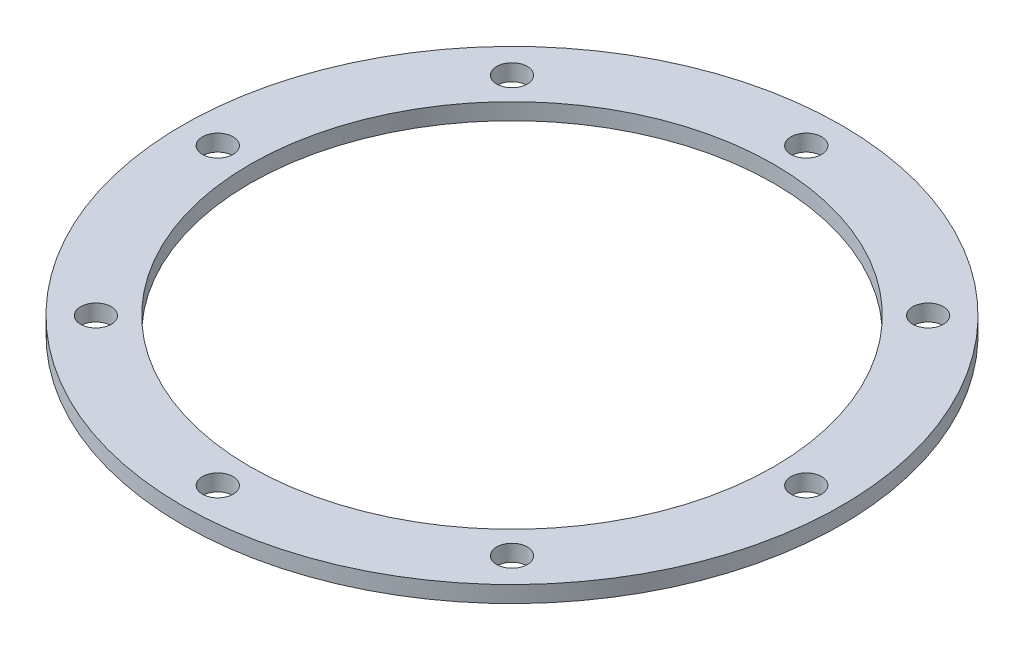
ISO-10303-21;
HEADER;
FILE_DESCRIPTION(('STEP AP214'),'2;1');
FILE_NAME('part.step','',(''),(''),'','','');
FILE_SCHEMA(('AUTOMOTIVE_DESIGN { 1 0 10303 214 1 1 1 1 }'));
ENDSEC;
DATA;
#1=APPLICATION_CONTEXT('core data for automotive mechanical design processes');
#2=APPLICATION_PROTOCOL_DEFINITION('international standard','automotive_design',2000,#1);
#3=PRODUCT_CONTEXT('',#1,'mechanical');
#4=PRODUCT('Part','Part','',(#3));
#5=PRODUCT_RELATED_PRODUCT_CATEGORY('part','',(#4));
#6=PRODUCT_DEFINITION_FORMATION('','',#4);
#7=PRODUCT_DEFINITION_CONTEXT('part definition',#1,'design');
#8=PRODUCT_DEFINITION('design','',#6,#7);
#9=PRODUCT_DEFINITION_SHAPE('','',#8);
#10=(LENGTH_UNIT() NAMED_UNIT(*) SI_UNIT(.MILLI.,.METRE.));
#11=(NAMED_UNIT(*) PLANE_ANGLE_UNIT() SI_UNIT($,.RADIAN.));
#12=(NAMED_UNIT(*) SI_UNIT($,.STERADIAN.) SOLID_ANGLE_UNIT());
#13=UNCERTAINTY_MEASURE_WITH_UNIT(LENGTH_MEASURE(1.E-05),#10,'distance_accuracy_value','');
#14=(GEOMETRIC_REPRESENTATION_CONTEXT(3) GLOBAL_UNCERTAINTY_ASSIGNED_CONTEXT((#13)) GLOBAL_UNIT_ASSIGNED_CONTEXT((#10,
#11,#12)) REPRESENTATION_CONTEXT('',''));
#15=CARTESIAN_POINT('',(0.,0.,0.));
#16=DIRECTION('',(0.,0.,1.));
#17=DIRECTION('',(1.,0.,0.));
#18=AXIS2_PLACEMENT_3D('',#15,#16,#17);
#19=CARTESIAN_POINT('',(0.,1.4,0.));
#20=DIRECTION('',(0.,1.,0.));
#21=DIRECTION('',(0.,0.,1.));
#22=AXIS2_PLACEMENT_3D('',#19,#20,#21);
#23=PLANE('',#22);
#24=CARTESIAN_POINT('',(17.6776695296635,1.4,-17.6776695296639));
#25=DIRECTION('',(0.,1.,0.));
#26=DIRECTION('',(0.,0.,1.));
#27=AXIS2_PLACEMENT_3D('',#24,#25,#26);
#28=CIRCLE('',#27,1.3);
#29=CARTESIAN_POINT('',(17.6776695296635,1.4,-16.3776695296639));
#30=VERTEX_POINT('',#29);
#31=EDGE_CURVE('E114',#30,#30,#28,.T.);
#32=ORIENTED_EDGE('',*,*,#31,.F.);
#33=EDGE_LOOP('',(#32));
#34=FACE_BOUND('',#33,.T.);
#35=CARTESIAN_POINT('',(25.,1.4,-2.61861100413235E-13));
#36=DIRECTION('',(0.,1.,0.));
#37=DIRECTION('',(0.,0.,1.));
#38=AXIS2_PLACEMENT_3D('',#35,#36,#37);
#39=CIRCLE('',#38,1.3);
#40=CARTESIAN_POINT('',(25.,1.4,1.29999999999974));
#41=VERTEX_POINT('',#40);
#42=EDGE_CURVE('E118',#41,#41,#39,.T.);
#43=ORIENTED_EDGE('',*,*,#42,.F.);
#44=EDGE_LOOP('',(#43));
#45=FACE_BOUND('',#44,.T.);
#46=CARTESIAN_POINT('',(17.6776695296638,1.4,17.6776695296635));
#47=DIRECTION('',(0.,1.,0.));
#48=DIRECTION('',(0.,0.,1.));
#49=AXIS2_PLACEMENT_3D('',#46,#47,#48);
#50=CIRCLE('',#49,1.3);
#51=CARTESIAN_POINT('',(17.6776695296638,1.4,18.9776695296635));
#52=VERTEX_POINT('',#51);
#53=EDGE_CURVE('E122',#52,#52,#50,.T.);
#54=ORIENTED_EDGE('',*,*,#53,.F.);
#55=EDGE_LOOP('',(#54));
#56=FACE_BOUND('',#55,.T.);
#57=CARTESIAN_POINT('',(0.,1.4,25.));
#58=DIRECTION('',(0.,1.,0.));
#59=DIRECTION('',(0.,0.,1.));
#60=AXIS2_PLACEMENT_3D('',#57,#58,#59);
#61=CIRCLE('',#60,1.3);
#62=CARTESIAN_POINT('',(0.,1.4,26.3));
#63=VERTEX_POINT('',#62);
#64=EDGE_CURVE('E74',#63,#63,#61,.T.);
#65=ORIENTED_EDGE('',*,*,#64,.F.);
#66=EDGE_LOOP('',(#65));
#67=FACE_BOUND('',#66,.T.);
#68=CARTESIAN_POINT('',(-17.6776695296636,1.4,17.6776695296638));
#69=DIRECTION('',(0.,1.,0.));
#70=DIRECTION('',(0.,0.,1.));
#71=AXIS2_PLACEMENT_3D('',#68,#69,#70);
#72=CIRCLE('',#71,1.3);
#73=CARTESIAN_POINT('',(-17.6776695296636,1.4,18.9776695296638));
#74=VERTEX_POINT('',#73);
#75=EDGE_CURVE('E63',#74,#74,#72,.T.);
#76=ORIENTED_EDGE('',*,*,#75,.F.);
#77=EDGE_LOOP('',(#76));
#78=FACE_BOUND('',#77,.T.);
#79=CARTESIAN_POINT('',(-25.,1.4,0.));
#80=DIRECTION('',(0.,1.,0.));
#81=DIRECTION('',(0.,0.,1.));
#82=AXIS2_PLACEMENT_3D('',#79,#80,#81);
#83=CIRCLE('',#82,1.3);
#84=CARTESIAN_POINT('',(-25.,1.4,1.30000000000009));
#85=VERTEX_POINT('',#84);
#86=EDGE_CURVE('E60',#85,#85,#83,.T.);
#87=ORIENTED_EDGE('',*,*,#86,.F.);
#88=EDGE_LOOP('',(#87));
#89=FACE_BOUND('',#88,.T.);
#90=CARTESIAN_POINT('',(-17.6776695296637,1.4,-17.6776695296637));
#91=DIRECTION('',(0.,1.,0.));
#92=DIRECTION('',(0.,0.,1.));
#93=AXIS2_PLACEMENT_3D('',#90,#91,#92);
#94=CIRCLE('',#93,1.3);
#95=CARTESIAN_POINT('',(-17.6776695296637,1.4,-16.3776695296637));
#96=VERTEX_POINT('',#95);
#97=EDGE_CURVE('E57',#96,#96,#94,.T.);
#98=ORIENTED_EDGE('',*,*,#97,.F.);
#99=EDGE_LOOP('',(#98));
#100=FACE_BOUND('',#99,.T.);
#101=CARTESIAN_POINT('',(0.,1.4,-25.));
#102=DIRECTION('',(0.,1.,0.));
#103=DIRECTION('',(0.,0.,1.));
#104=AXIS2_PLACEMENT_3D('',#101,#102,#103);
#105=CIRCLE('',#104,1.3);
#106=CARTESIAN_POINT('',(0.,1.4,-23.7));
#107=VERTEX_POINT('',#106);
#108=EDGE_CURVE('E56',#107,#107,#105,.T.);
#109=ORIENTED_EDGE('',*,*,#108,.F.);
#110=EDGE_LOOP('',(#109));
#111=FACE_BOUND('',#110,.T.);
#112=CARTESIAN_POINT('',(0.,1.4,0.));
#113=DIRECTION('',(0.,1.,0.));
#114=DIRECTION('',(0.,0.,1.));
#115=AXIS2_PLACEMENT_3D('',#112,#113,#114);
#116=CIRCLE('',#115,28.);
#117=CARTESIAN_POINT('',(0.,1.4,28.));
#118=VERTEX_POINT('',#117);
#119=EDGE_CURVE('E10',#118,#118,#116,.T.);
#120=ORIENTED_EDGE('',*,*,#119,.T.);
#121=EDGE_LOOP('',(#120));
#122=FACE_BOUND('',#121,.T.);
#123=CARTESIAN_POINT('',(0.,1.4,0.));
#124=DIRECTION('',(0.,1.,0.));
#125=DIRECTION('',(0.,0.,1.));
#126=AXIS2_PLACEMENT_3D('',#123,#124,#125);
#127=CIRCLE('',#126,22.25);
#128=CARTESIAN_POINT('',(0.,1.4,22.25));
#129=VERTEX_POINT('',#128);
#130=EDGE_CURVE('E47',#129,#129,#127,.T.);
#131=ORIENTED_EDGE('',*,*,#130,.F.);
#132=EDGE_LOOP('',(#131));
#133=FACE_BOUND('',#132,.T.);
#134=ADVANCED_FACE('F34',(#34,#45,#56,#67,#78,#89,#100,#111,#122,#133),#23,.T.);
#135=CARTESIAN_POINT('',(0.,0.,0.));
#136=DIRECTION('',(0.,1.,0.));
#137=DIRECTION('',(0.,0.,1.));
#138=AXIS2_PLACEMENT_3D('',#135,#136,#137);
#139=PLANE('',#138);
#140=CARTESIAN_POINT('',(17.6776695296635,0.,-17.6776695296639));
#141=DIRECTION('',(0.,1.,0.));
#142=DIRECTION('',(0.,0.,1.));
#143=AXIS2_PLACEMENT_3D('',#140,#141,#142);
#144=CIRCLE('',#143,1.3);
#145=CARTESIAN_POINT('',(17.6776695296635,0.,-16.3776695296639));
#146=VERTEX_POINT('',#145);
#147=EDGE_CURVE('E38',#146,#146,#144,.T.);
#148=ORIENTED_EDGE('',*,*,#147,.T.);
#149=EDGE_LOOP('',(#148));
#150=FACE_BOUND('',#149,.T.);
#151=CARTESIAN_POINT('',(25.,0.,-2.61861100413235E-13));
#152=DIRECTION('',(0.,1.,0.));
#153=DIRECTION('',(0.,0.,1.));
#154=AXIS2_PLACEMENT_3D('',#151,#152,#153);
#155=CIRCLE('',#154,1.3);
#156=CARTESIAN_POINT('',(25.,0.,1.29999999999974));
#157=VERTEX_POINT('',#156);
#158=EDGE_CURVE('E175',#157,#157,#155,.T.);
#159=ORIENTED_EDGE('',*,*,#158,.T.);
#160=EDGE_LOOP('',(#159));
#161=FACE_BOUND('',#160,.T.);
#162=CARTESIAN_POINT('',(17.6776695296638,0.,17.6776695296635));
#163=DIRECTION('',(0.,1.,0.));
#164=DIRECTION('',(0.,0.,1.));
#165=AXIS2_PLACEMENT_3D('',#162,#163,#164);
#166=CIRCLE('',#165,1.3);
#167=CARTESIAN_POINT('',(17.6776695296638,0.,18.9776695296635));
#168=VERTEX_POINT('',#167);
#169=EDGE_CURVE('E182',#168,#168,#166,.T.);
#170=ORIENTED_EDGE('',*,*,#169,.T.);
#171=EDGE_LOOP('',(#170));
#172=FACE_BOUND('',#171,.T.);
#173=CARTESIAN_POINT('',(0.,0.,25.));
#174=DIRECTION('',(0.,1.,0.));
#175=DIRECTION('',(0.,0.,1.));
#176=AXIS2_PLACEMENT_3D('',#173,#174,#175);
#177=CIRCLE('',#176,1.3);
#178=CARTESIAN_POINT('',(0.,0.,26.3));
#179=VERTEX_POINT('',#178);
#180=EDGE_CURVE('E69',#179,#179,#177,.T.);
#181=ORIENTED_EDGE('',*,*,#180,.T.);
#182=EDGE_LOOP('',(#181));
#183=FACE_BOUND('',#182,.T.);
#184=CARTESIAN_POINT('',(-17.6776695296636,0.,17.6776695296638));
#185=DIRECTION('',(0.,1.,0.));
#186=DIRECTION('',(0.,0.,1.));
#187=AXIS2_PLACEMENT_3D('',#184,#185,#186);
#188=CIRCLE('',#187,1.3);
#189=CARTESIAN_POINT('',(-17.6776695296636,0.,18.9776695296638));
#190=VERTEX_POINT('',#189);
#191=EDGE_CURVE('E61',#190,#190,#188,.T.);
#192=ORIENTED_EDGE('',*,*,#191,.T.);
#193=EDGE_LOOP('',(#192));
#194=FACE_BOUND('',#193,.T.);
#195=CARTESIAN_POINT('',(-25.,0.,0.));
#196=DIRECTION('',(0.,1.,0.));
#197=DIRECTION('',(0.,0.,1.));
#198=AXIS2_PLACEMENT_3D('',#195,#196,#197);
#199=CIRCLE('',#198,1.3);
#200=CARTESIAN_POINT('',(-25.,0.,1.30000000000008));
#201=VERTEX_POINT('',#200);
#202=EDGE_CURVE('E58',#201,#201,#199,.T.);
#203=ORIENTED_EDGE('',*,*,#202,.T.);
#204=EDGE_LOOP('',(#203));
#205=FACE_BOUND('',#204,.T.);
#206=CARTESIAN_POINT('',(-17.6776695296637,0.,-17.6776695296637));
#207=DIRECTION('',(0.,1.,0.));
#208=DIRECTION('',(0.,0.,1.));
#209=AXIS2_PLACEMENT_3D('',#206,#207,#208);
#210=CIRCLE('',#209,1.3);
#211=CARTESIAN_POINT('',(-17.6776695296637,0.,-16.3776695296637));
#212=VERTEX_POINT('',#211);
#213=EDGE_CURVE('E53',#212,#212,#210,.T.);
#214=ORIENTED_EDGE('',*,*,#213,.T.);
#215=EDGE_LOOP('',(#214));
#216=FACE_BOUND('',#215,.T.);
#217=CARTESIAN_POINT('',(0.,0.,-25.));
#218=DIRECTION('',(0.,1.,0.));
#219=DIRECTION('',(0.,0.,1.));
#220=AXIS2_PLACEMENT_3D('',#217,#218,#219);
#221=CIRCLE('',#220,1.3);
#222=CARTESIAN_POINT('',(0.,0.,-23.7));
#223=VERTEX_POINT('',#222);
#224=EDGE_CURVE('E82',#223,#223,#221,.T.);
#225=ORIENTED_EDGE('',*,*,#224,.T.);
#226=EDGE_LOOP('',(#225));
#227=FACE_BOUND('',#226,.T.);
#228=CARTESIAN_POINT('',(0.,0.,0.));
#229=DIRECTION('',(0.,1.,0.));
#230=DIRECTION('',(0.,0.,1.));
#231=AXIS2_PLACEMENT_3D('',#228,#229,#230);
#232=CIRCLE('',#231,28.);
#233=CARTESIAN_POINT('',(0.,0.,28.));
#234=VERTEX_POINT('',#233);
#235=EDGE_CURVE('E42',#234,#234,#232,.T.);
#236=ORIENTED_EDGE('',*,*,#235,.F.);
#237=EDGE_LOOP('',(#236));
#238=FACE_BOUND('',#237,.T.);
#239=CARTESIAN_POINT('',(0.,0.,0.));
#240=DIRECTION('',(0.,1.,0.));
#241=DIRECTION('',(0.,0.,1.));
#242=AXIS2_PLACEMENT_3D('',#239,#240,#241);
#243=CIRCLE('',#242,22.25);
#244=CARTESIAN_POINT('',(0.,0.,22.25));
#245=VERTEX_POINT('',#244);
#246=EDGE_CURVE('E50',#245,#245,#243,.T.);
#247=ORIENTED_EDGE('',*,*,#246,.T.);
#248=EDGE_LOOP('',(#247));
#249=FACE_BOUND('',#248,.T.);
#250=ADVANCED_FACE('F90',(#150,#161,#172,#183,#194,#205,#216,#227,#238,#249),#139,.F.);
#251=CARTESIAN_POINT('',(0.,1.4,0.));
#252=DIRECTION('',(0.,-1.,0.));
#253=DIRECTION('',(0.,0.,-1.));
#254=AXIS2_PLACEMENT_3D('',#251,#252,#253);
#255=CYLINDRICAL_SURFACE('',#254,28.);
#256=ORIENTED_EDGE('',*,*,#119,.F.);
#257=EDGE_LOOP('',(#256));
#258=FACE_BOUND('',#257,.T.);
#259=ORIENTED_EDGE('',*,*,#235,.T.);
#260=EDGE_LOOP('',(#259));
#261=FACE_BOUND('',#260,.T.);
#262=ADVANCED_FACE('F36',(#258,#261),#255,.T.);
#263=CARTESIAN_POINT('',(0.,1.4,0.));
#264=DIRECTION('',(0.,-1.,0.));
#265=DIRECTION('',(0.,0.,-1.));
#266=AXIS2_PLACEMENT_3D('',#263,#264,#265);
#267=CYLINDRICAL_SURFACE('',#266,22.25);
#268=ORIENTED_EDGE('',*,*,#130,.T.);
#269=EDGE_LOOP('',(#268));
#270=FACE_BOUND('',#269,.T.);
#271=ORIENTED_EDGE('',*,*,#246,.F.);
#272=EDGE_LOOP('',(#271));
#273=FACE_BOUND('',#272,.T.);
#274=ADVANCED_FACE('F92',(#270,#273),#267,.F.);
#275=CARTESIAN_POINT('',(0.,1.4,-25.));
#276=DIRECTION('',(0.,1.,0.));
#277=DIRECTION('',(0.,0.,1.));
#278=AXIS2_PLACEMENT_3D('',#275,#276,#277);
#279=CYLINDRICAL_SURFACE('',#278,1.3);
#280=ORIENTED_EDGE('',*,*,#108,.T.);
#281=EDGE_LOOP('',(#280));
#282=FACE_BOUND('',#281,.T.);
#283=ORIENTED_EDGE('',*,*,#224,.F.);
#284=EDGE_LOOP('',(#283));
#285=FACE_BOUND('',#284,.T.);
#286=ADVANCED_FACE('F94',(#282,#285),#279,.F.);
#287=CARTESIAN_POINT('',(-17.6776695296637,1.4,-17.6776695296637));
#288=DIRECTION('',(0.,1.,0.));
#289=DIRECTION('',(0.,0.,1.));
#290=AXIS2_PLACEMENT_3D('',#287,#288,#289);
#291=CYLINDRICAL_SURFACE('',#290,1.3);
#292=ORIENTED_EDGE('',*,*,#97,.T.);
#293=EDGE_LOOP('',(#292));
#294=FACE_BOUND('',#293,.T.);
#295=ORIENTED_EDGE('',*,*,#213,.F.);
#296=EDGE_LOOP('',(#295));
#297=FACE_BOUND('',#296,.T.);
#298=ADVANCED_FACE('F100',(#294,#297),#291,.F.);
#299=CARTESIAN_POINT('',(-25.,1.4,0.));
#300=DIRECTION('',(0.,1.,0.));
#301=DIRECTION('',(0.,0.,1.));
#302=AXIS2_PLACEMENT_3D('',#299,#300,#301);
#303=CYLINDRICAL_SURFACE('',#302,1.3);
#304=ORIENTED_EDGE('',*,*,#86,.T.);
#305=EDGE_LOOP('',(#304));
#306=FACE_BOUND('',#305,.T.);
#307=ORIENTED_EDGE('',*,*,#202,.F.);
#308=EDGE_LOOP('',(#307));
#309=FACE_BOUND('',#308,.T.);
#310=ADVANCED_FACE('F142',(#306,#309),#303,.F.);
#311=CARTESIAN_POINT('',(-17.6776695296636,1.4,17.6776695296638));
#312=DIRECTION('',(0.,1.,0.));
#313=DIRECTION('',(0.,0.,1.));
#314=AXIS2_PLACEMENT_3D('',#311,#312,#313);
#315=CYLINDRICAL_SURFACE('',#314,1.3);
#316=ORIENTED_EDGE('',*,*,#75,.T.);
#317=EDGE_LOOP('',(#316));
#318=FACE_BOUND('',#317,.T.);
#319=ORIENTED_EDGE('',*,*,#191,.F.);
#320=EDGE_LOOP('',(#319));
#321=FACE_BOUND('',#320,.T.);
#322=ADVANCED_FACE('F149',(#318,#321),#315,.F.);
#323=CARTESIAN_POINT('',(0.,1.4,25.));
#324=DIRECTION('',(0.,1.,0.));
#325=DIRECTION('',(0.,0.,1.));
#326=AXIS2_PLACEMENT_3D('',#323,#324,#325);
#327=CYLINDRICAL_SURFACE('',#326,1.3);
#328=ORIENTED_EDGE('',*,*,#64,.T.);
#329=EDGE_LOOP('',(#328));
#330=FACE_BOUND('',#329,.T.);
#331=ORIENTED_EDGE('',*,*,#180,.F.);
#332=EDGE_LOOP('',(#331));
#333=FACE_BOUND('',#332,.T.);
#334=ADVANCED_FACE('F155',(#330,#333),#327,.F.);
#335=CARTESIAN_POINT('',(17.6776695296638,1.4,17.6776695296635));
#336=DIRECTION('',(0.,1.,0.));
#337=DIRECTION('',(0.,0.,1.));
#338=AXIS2_PLACEMENT_3D('',#335,#336,#337);
#339=CYLINDRICAL_SURFACE('',#338,1.3);
#340=ORIENTED_EDGE('',*,*,#53,.T.);
#341=EDGE_LOOP('',(#340));
#342=FACE_BOUND('',#341,.T.);
#343=ORIENTED_EDGE('',*,*,#169,.F.);
#344=EDGE_LOOP('',(#343));
#345=FACE_BOUND('',#344,.T.);
#346=ADVANCED_FACE('F158',(#342,#345),#339,.F.);
#347=CARTESIAN_POINT('',(25.,1.4,-2.61861100413235E-13));
#348=DIRECTION('',(0.,1.,0.));
#349=DIRECTION('',(0.,0.,1.));
#350=AXIS2_PLACEMENT_3D('',#347,#348,#349);
#351=CYLINDRICAL_SURFACE('',#350,1.3);
#352=ORIENTED_EDGE('',*,*,#42,.T.);
#353=EDGE_LOOP('',(#352));
#354=FACE_BOUND('',#353,.T.);
#355=ORIENTED_EDGE('',*,*,#158,.F.);
#356=EDGE_LOOP('',(#355));
#357=FACE_BOUND('',#356,.T.);
#358=ADVANCED_FACE('F162',(#354,#357),#351,.F.);
#359=CARTESIAN_POINT('',(17.6776695296635,1.4,-17.6776695296639));
#360=DIRECTION('',(0.,1.,0.));
#361=DIRECTION('',(0.,0.,1.));
#362=AXIS2_PLACEMENT_3D('',#359,#360,#361);
#363=CYLINDRICAL_SURFACE('',#362,1.3);
#364=ORIENTED_EDGE('',*,*,#31,.T.);
#365=EDGE_LOOP('',(#364));
#366=FACE_BOUND('',#365,.T.);
#367=ORIENTED_EDGE('',*,*,#147,.F.);
#368=EDGE_LOOP('',(#367));
#369=FACE_BOUND('',#368,.T.);
#370=ADVANCED_FACE('F166',(#366,#369),#363,.F.);
#371=CLOSED_SHELL('',(#134,#250,#262,#274,#286,#298,#310,#322,#334,#346,#358,#370));
#372=MANIFOLD_SOLID_BREP('B2',#371);
#373=ADVANCED_BREP_SHAPE_REPRESENTATION('',(#18,#372),#14);
#374=SHAPE_DEFINITION_REPRESENTATION(#9,#373);
ENDSEC;
END-ISO-10303-21;
